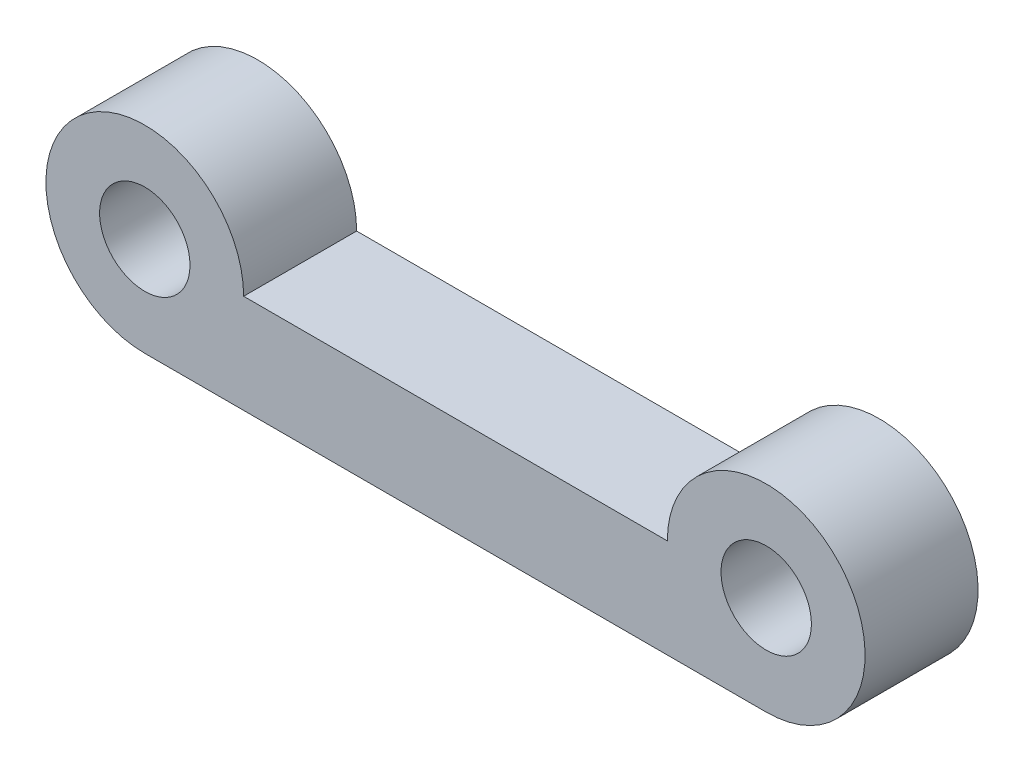
ISO-10303-21;
HEADER;
FILE_DESCRIPTION(('STEP AP214'),'2;1');
FILE_NAME('part.step','',(''),(''),'','','');
FILE_SCHEMA(('AUTOMOTIVE_DESIGN { 1 0 10303 214 1 1 1 1 }'));
ENDSEC;
DATA;
#1=APPLICATION_CONTEXT('core data for automotive mechanical design processes');
#2=APPLICATION_PROTOCOL_DEFINITION('international standard','automotive_design',2000,#1);
#3=PRODUCT_CONTEXT('',#1,'mechanical');
#4=PRODUCT('Part','Part','',(#3));
#5=PRODUCT_RELATED_PRODUCT_CATEGORY('part','',(#4));
#6=PRODUCT_DEFINITION_FORMATION('','',#4);
#7=PRODUCT_DEFINITION_CONTEXT('part definition',#1,'design');
#8=PRODUCT_DEFINITION('design','',#6,#7);
#9=PRODUCT_DEFINITION_SHAPE('','',#8);
#10=(LENGTH_UNIT() NAMED_UNIT(*) SI_UNIT(.MILLI.,.METRE.));
#11=(NAMED_UNIT(*) PLANE_ANGLE_UNIT() SI_UNIT($,.RADIAN.));
#12=(NAMED_UNIT(*) SI_UNIT($,.STERADIAN.) SOLID_ANGLE_UNIT());
#13=UNCERTAINTY_MEASURE_WITH_UNIT(LENGTH_MEASURE(1.E-05),#10,'distance_accuracy_value','');
#14=(GEOMETRIC_REPRESENTATION_CONTEXT(3) GLOBAL_UNCERTAINTY_ASSIGNED_CONTEXT((#13)) GLOBAL_UNIT_ASSIGNED_CONTEXT((#10,
#11,#12)) REPRESENTATION_CONTEXT('',''));
#15=CARTESIAN_POINT('',(0.,0.,0.));
#16=DIRECTION('',(0.,0.,1.));
#17=DIRECTION('',(1.,0.,0.));
#18=AXIS2_PLACEMENT_3D('',#15,#16,#17);
#19=CARTESIAN_POINT('',(0.,0.,4.));
#20=DIRECTION('',(0.,0.,1.));
#21=DIRECTION('',(1.,0.,0.));
#22=AXIS2_PLACEMENT_3D('',#19,#20,#21);
#23=PLANE('',#22);
#24=CARTESIAN_POINT('',(0.,0.,4.));
#25=DIRECTION('',(0.,0.,1.));
#26=DIRECTION('',(1.,0.,0.));
#27=AXIS2_PLACEMENT_3D('',#24,#25,#26);
#28=CIRCLE('',#27,1.6);
#29=CARTESIAN_POINT('',(1.6,0.,4.));
#30=VERTEX_POINT('',#29);
#31=EDGE_CURVE('E100',#30,#30,#28,.T.);
#32=ORIENTED_EDGE('',*,*,#31,.F.);
#33=EDGE_LOOP('',(#32));
#34=FACE_BOUND('',#33,.T.);
#35=CARTESIAN_POINT('',(0.,0.,4.));
#36=DIRECTION('',(0.,0.,1.));
#37=DIRECTION('',(1.,0.,0.));
#38=AXIS2_PLACEMENT_3D('',#35,#36,#37);
#39=CIRCLE('',#38,3.5);
#40=CARTESIAN_POINT('',(3.5,0.,4.));
#41=VERTEX_POINT('',#40);
#42=CARTESIAN_POINT('',(0.,-3.5,4.));
#43=VERTEX_POINT('',#42);
#44=EDGE_CURVE('E85',#41,#43,#39,.T.);
#45=ORIENTED_EDGE('',*,*,#44,.T.);
#46=DIRECTION('',(1.,0.,0.));
#47=VECTOR('',#46,1.);
#48=CARTESIAN_POINT('',(0.,-3.5,4.));
#49=LINE('',#48,#47);
#50=CARTESIAN_POINT('',(22.,-3.5,4.));
#51=VERTEX_POINT('',#50);
#52=EDGE_CURVE('E80',#43,#51,#49,.T.);
#53=ORIENTED_EDGE('',*,*,#52,.T.);
#54=CARTESIAN_POINT('',(22.,0.,4.));
#55=DIRECTION('',(0.,0.,1.));
#56=DIRECTION('',(1.,0.,0.));
#57=AXIS2_PLACEMENT_3D('',#54,#55,#56);
#58=CIRCLE('',#57,3.5);
#59=CARTESIAN_POINT('',(18.5,0.,4.));
#60=VERTEX_POINT('',#59);
#61=EDGE_CURVE('E83',#51,#60,#58,.T.);
#62=ORIENTED_EDGE('',*,*,#61,.T.);
#63=DIRECTION('',(-1.,0.,0.));
#64=VECTOR('',#63,1.);
#65=CARTESIAN_POINT('',(3.5,0.,4.));
#66=LINE('',#65,#64);
#67=EDGE_CURVE('E50',#60,#41,#66,.T.);
#68=ORIENTED_EDGE('',*,*,#67,.T.);
#69=EDGE_LOOP('',(#45,#53,#62,#68));
#70=FACE_BOUND('',#69,.T.);
#71=CARTESIAN_POINT('',(22.,0.,4.));
#72=DIRECTION('',(0.,0.,1.));
#73=DIRECTION('',(1.,0.,0.));
#74=AXIS2_PLACEMENT_3D('',#71,#72,#73);
#75=CIRCLE('',#74,1.6);
#76=CARTESIAN_POINT('',(23.6,0.,4.));
#77=VERTEX_POINT('',#76);
#78=EDGE_CURVE('E115',#77,#77,#75,.T.);
#79=ORIENTED_EDGE('',*,*,#78,.F.);
#80=EDGE_LOOP('',(#79));
#81=FACE_BOUND('',#80,.T.);
#82=ADVANCED_FACE('F33',(#34,#70,#81),#23,.T.);
#83=CARTESIAN_POINT('',(0.,0.,0.));
#84=DIRECTION('',(0.,0.,1.));
#85=DIRECTION('',(1.,0.,0.));
#86=AXIS2_PLACEMENT_3D('',#83,#84,#85);
#87=PLANE('',#86);
#88=CARTESIAN_POINT('',(0.,0.,0.));
#89=DIRECTION('',(0.,0.,1.));
#90=DIRECTION('',(1.,0.,0.));
#91=AXIS2_PLACEMENT_3D('',#88,#89,#90);
#92=CIRCLE('',#91,3.5);
#93=CARTESIAN_POINT('',(3.5,0.,0.));
#94=VERTEX_POINT('',#93);
#95=CARTESIAN_POINT('',(0.,-3.5,0.));
#96=VERTEX_POINT('',#95);
#97=EDGE_CURVE('E97',#94,#96,#92,.T.);
#98=ORIENTED_EDGE('',*,*,#97,.F.);
#99=DIRECTION('',(-1.,0.,0.));
#100=VECTOR('',#99,1.);
#101=CARTESIAN_POINT('',(3.5,0.,0.));
#102=LINE('',#101,#100);
#103=CARTESIAN_POINT('',(18.5,0.,0.));
#104=VERTEX_POINT('',#103);
#105=EDGE_CURVE('E73',#104,#94,#102,.T.);
#106=ORIENTED_EDGE('',*,*,#105,.F.);
#107=CARTESIAN_POINT('',(22.,0.,0.));
#108=DIRECTION('',(0.,0.,1.));
#109=DIRECTION('',(1.,0.,0.));
#110=AXIS2_PLACEMENT_3D('',#107,#108,#109);
#111=CIRCLE('',#110,3.5);
#112=CARTESIAN_POINT('',(22.,-3.5,0.));
#113=VERTEX_POINT('',#112);
#114=EDGE_CURVE('E67',#113,#104,#111,.T.);
#115=ORIENTED_EDGE('',*,*,#114,.F.);
#116=DIRECTION('',(1.,0.,0.));
#117=VECTOR('',#116,1.);
#118=CARTESIAN_POINT('',(0.,-3.5,0.));
#119=LINE('',#118,#117);
#120=EDGE_CURVE('E89',#96,#113,#119,.T.);
#121=ORIENTED_EDGE('',*,*,#120,.F.);
#122=EDGE_LOOP('',(#98,#106,#115,#121));
#123=FACE_BOUND('',#122,.T.);
#124=CARTESIAN_POINT('',(0.,0.,0.));
#125=DIRECTION('',(0.,0.,1.));
#126=DIRECTION('',(1.,0.,0.));
#127=AXIS2_PLACEMENT_3D('',#124,#125,#126);
#128=CIRCLE('',#127,1.6);
#129=CARTESIAN_POINT('',(1.6,0.,0.));
#130=VERTEX_POINT('',#129);
#131=EDGE_CURVE('E112',#130,#130,#128,.T.);
#132=ORIENTED_EDGE('',*,*,#131,.T.);
#133=EDGE_LOOP('',(#132));
#134=FACE_BOUND('',#133,.T.);
#135=CARTESIAN_POINT('',(22.,0.,0.));
#136=DIRECTION('',(0.,0.,1.));
#137=DIRECTION('',(1.,0.,0.));
#138=AXIS2_PLACEMENT_3D('',#135,#136,#137);
#139=CIRCLE('',#138,1.6);
#140=CARTESIAN_POINT('',(23.6,0.,0.));
#141=VERTEX_POINT('',#140);
#142=EDGE_CURVE('E118',#141,#141,#139,.T.);
#143=ORIENTED_EDGE('',*,*,#142,.T.);
#144=EDGE_LOOP('',(#143));
#145=FACE_BOUND('',#144,.T.);
#146=ADVANCED_FACE('F108',(#123,#134,#145),#87,.F.);
#147=CARTESIAN_POINT('',(0.,0.,4.));
#148=DIRECTION('',(0.,0.,-1.));
#149=DIRECTION('',(-1.,0.,0.));
#150=AXIS2_PLACEMENT_3D('',#147,#148,#149);
#151=CYLINDRICAL_SURFACE('',#150,3.5);
#152=ORIENTED_EDGE('',*,*,#97,.T.);
#153=DIRECTION('',(0.,0.,-1.));
#154=VECTOR('',#153,1.);
#155=CARTESIAN_POINT('',(0.,-3.5,4.));
#156=LINE('',#155,#154);
#157=EDGE_CURVE('E11',#43,#96,#156,.T.);
#158=ORIENTED_EDGE('',*,*,#157,.F.);
#159=ORIENTED_EDGE('',*,*,#44,.F.);
#160=DIRECTION('',(0.,0.,-1.));
#161=VECTOR('',#160,1.);
#162=CARTESIAN_POINT('',(3.5,0.,4.));
#163=LINE('',#162,#161);
#164=EDGE_CURVE('E93',#41,#94,#163,.T.);
#165=ORIENTED_EDGE('',*,*,#164,.T.);
#166=EDGE_LOOP('',(#152,#158,#159,#165));
#167=FACE_BOUND('',#166,.T.);
#168=ADVANCED_FACE('F35',(#167),#151,.T.);
#169=CARTESIAN_POINT('',(0.,-3.5,4.));
#170=DIRECTION('',(0.,1.,0.));
#171=DIRECTION('',(0.,0.,1.));
#172=AXIS2_PLACEMENT_3D('',#169,#170,#171);
#173=PLANE('',#172);
#174=ORIENTED_EDGE('',*,*,#120,.T.);
#175=DIRECTION('',(0.,0.,-1.));
#176=VECTOR('',#175,1.);
#177=CARTESIAN_POINT('',(22.,-3.5,4.));
#178=LINE('',#177,#176);
#179=EDGE_CURVE('E42',#51,#113,#178,.T.);
#180=ORIENTED_EDGE('',*,*,#179,.F.);
#181=ORIENTED_EDGE('',*,*,#52,.F.);
#182=ORIENTED_EDGE('',*,*,#157,.T.);
#183=EDGE_LOOP('',(#174,#180,#181,#182));
#184=FACE_BOUND('',#183,.T.);
#185=ADVANCED_FACE('F88',(#184),#173,.F.);
#186=CARTESIAN_POINT('',(22.,0.,4.));
#187=DIRECTION('',(0.,0.,-1.));
#188=DIRECTION('',(-1.,0.,0.));
#189=AXIS2_PLACEMENT_3D('',#186,#187,#188);
#190=CYLINDRICAL_SURFACE('',#189,3.5);
#191=ORIENTED_EDGE('',*,*,#114,.T.);
#192=DIRECTION('',(0.,0.,-1.));
#193=VECTOR('',#192,1.);
#194=CARTESIAN_POINT('',(18.5,0.,4.));
#195=LINE('',#194,#193);
#196=EDGE_CURVE('E90',#60,#104,#195,.T.);
#197=ORIENTED_EDGE('',*,*,#196,.F.);
#198=ORIENTED_EDGE('',*,*,#61,.F.);
#199=ORIENTED_EDGE('',*,*,#179,.T.);
#200=EDGE_LOOP('',(#191,#197,#198,#199));
#201=FACE_BOUND('',#200,.T.);
#202=ADVANCED_FACE('F91',(#201),#190,.T.);
#203=CARTESIAN_POINT('',(3.5,0.,4.));
#204=DIRECTION('',(0.,-1.,0.));
#205=DIRECTION('',(0.,0.,-1.));
#206=AXIS2_PLACEMENT_3D('',#203,#204,#205);
#207=PLANE('',#206);
#208=ORIENTED_EDGE('',*,*,#105,.T.);
#209=ORIENTED_EDGE('',*,*,#164,.F.);
#210=ORIENTED_EDGE('',*,*,#67,.F.);
#211=ORIENTED_EDGE('',*,*,#196,.T.);
#212=EDGE_LOOP('',(#208,#209,#210,#211));
#213=FACE_BOUND('',#212,.T.);
#214=ADVANCED_FACE('F105',(#213),#207,.F.);
#215=CARTESIAN_POINT('',(0.,0.,4.));
#216=DIRECTION('',(0.,0.,-1.));
#217=DIRECTION('',(-1.,0.,0.));
#218=AXIS2_PLACEMENT_3D('',#215,#216,#217);
#219=CYLINDRICAL_SURFACE('',#218,1.6);
#220=ORIENTED_EDGE('',*,*,#31,.T.);
#221=EDGE_LOOP('',(#220));
#222=FACE_BOUND('',#221,.T.);
#223=ORIENTED_EDGE('',*,*,#131,.F.);
#224=EDGE_LOOP('',(#223));
#225=FACE_BOUND('',#224,.T.);
#226=ADVANCED_FACE('F135',(#222,#225),#219,.F.);
#227=CARTESIAN_POINT('',(22.,0.,4.));
#228=DIRECTION('',(0.,0.,-1.));
#229=DIRECTION('',(-1.,0.,0.));
#230=AXIS2_PLACEMENT_3D('',#227,#228,#229);
#231=CYLINDRICAL_SURFACE('',#230,1.6);
#232=ORIENTED_EDGE('',*,*,#78,.T.);
#233=EDGE_LOOP('',(#232));
#234=FACE_BOUND('',#233,.T.);
#235=ORIENTED_EDGE('',*,*,#142,.F.);
#236=EDGE_LOOP('',(#235));
#237=FACE_BOUND('',#236,.T.);
#238=ADVANCED_FACE('F124',(#234,#237),#231,.F.);
#239=CLOSED_SHELL('',(#82,#146,#168,#185,#202,#214,#226,#238));
#240=MANIFOLD_SOLID_BREP('B2',#239);
#241=ADVANCED_BREP_SHAPE_REPRESENTATION('',(#18,#240),#14);
#242=SHAPE_DEFINITION_REPRESENTATION(#9,#241);
ENDSEC;
END-ISO-10303-21;
